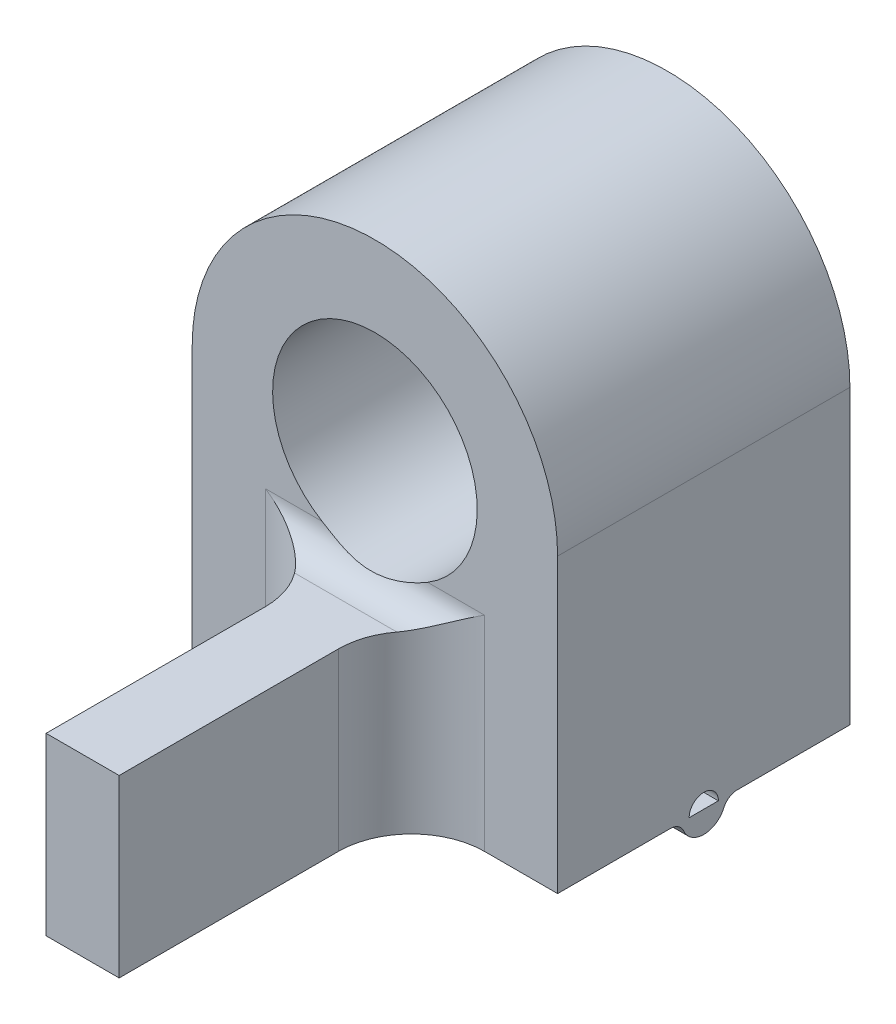
ISO-10303-21;
HEADER;
FILE_DESCRIPTION(('STEP AP214'),'2;1');
FILE_NAME('part.step','',(''),(''),'','','');
FILE_SCHEMA(('AUTOMOTIVE_DESIGN { 1 0 10303 214 1 1 1 1 }'));
ENDSEC;
DATA;
#1=APPLICATION_CONTEXT('core data for automotive mechanical design processes');
#2=APPLICATION_PROTOCOL_DEFINITION('international standard','automotive_design',2000,#1);
#3=PRODUCT_CONTEXT('',#1,'mechanical');
#4=PRODUCT('Part','Part','',(#3));
#5=PRODUCT_RELATED_PRODUCT_CATEGORY('part','',(#4));
#6=PRODUCT_DEFINITION_FORMATION('','',#4);
#7=PRODUCT_DEFINITION_CONTEXT('part definition',#1,'design');
#8=PRODUCT_DEFINITION('design','',#6,#7);
#9=PRODUCT_DEFINITION_SHAPE('','',#8);
#10=(LENGTH_UNIT() NAMED_UNIT(*) SI_UNIT(.MILLI.,.METRE.));
#11=(NAMED_UNIT(*) PLANE_ANGLE_UNIT() SI_UNIT($,.RADIAN.));
#12=(NAMED_UNIT(*) SI_UNIT($,.STERADIAN.) SOLID_ANGLE_UNIT());
#13=UNCERTAINTY_MEASURE_WITH_UNIT(LENGTH_MEASURE(1.E-05),#10,'distance_accuracy_value','');
#14=(GEOMETRIC_REPRESENTATION_CONTEXT(3) GLOBAL_UNCERTAINTY_ASSIGNED_CONTEXT((#13)) GLOBAL_UNIT_ASSIGNED_CONTEXT((#10,
#11,#12)) REPRESENTATION_CONTEXT('',''));
#15=CARTESIAN_POINT('',(0.,0.,0.));
#16=DIRECTION('',(0.,0.,1.));
#17=DIRECTION('',(1.,0.,0.));
#18=AXIS2_PLACEMENT_3D('',#15,#16,#17);
#19=CARTESIAN_POINT('',(12.5,0.,20.));
#20=DIRECTION('',(1.,0.,0.));
#21=DIRECTION('',(0.,1.,0.));
#22=AXIS2_PLACEMENT_3D('',#19,#20,#21);
#23=PLANE('',#22);
#24=CARTESIAN_POINT('',(12.5,-20.,10.));
#25=DIRECTION('',(1.,0.,0.));
#26=DIRECTION('',(0.,1.,0.));
#27=AXIS2_PLACEMENT_3D('',#24,#25,#26);
#28=CIRCLE('',#27,1.);
#29=CARTESIAN_POINT('',(12.5,-20.,9.));
#30=VERTEX_POINT('',#29);
#31=CARTESIAN_POINT('',(12.5,-20.,11.));
#32=VERTEX_POINT('',#31);
#33=EDGE_CURVE('E50',#30,#32,#28,.T.);
#34=ORIENTED_EDGE('',*,*,#33,.F.);
#35=DIRECTION('',(0.,0.,-1.));
#36=VECTOR('',#35,1.);
#37=CARTESIAN_POINT('',(12.5,-20.,9.));
#38=LINE('',#37,#36);
#39=EDGE_CURVE('E207',#32,#30,#38,.T.);
#40=ORIENTED_EDGE('',*,*,#39,.F.);
#41=EDGE_LOOP('',(#34,#40));
#42=FACE_BOUND('',#41,.T.);
#43=DIRECTION('',(0.,-1.,0.));
#44=VECTOR('',#43,1.);
#45=CARTESIAN_POINT('',(12.5,0.,0.));
#46=LINE('',#45,#44);
#47=CARTESIAN_POINT('',(12.5,0.,0.));
#48=VERTEX_POINT('',#47);
#49=CARTESIAN_POINT('',(12.5,-20.,0.));
#50=VERTEX_POINT('',#49);
#51=EDGE_CURVE('E333',#48,#50,#46,.T.);
#52=ORIENTED_EDGE('',*,*,#51,.F.);
#53=DIRECTION('',(0.,0.,-1.));
#54=VECTOR('',#53,1.);
#55=CARTESIAN_POINT('',(12.5,0.,20.));
#56=LINE('',#55,#54);
#57=CARTESIAN_POINT('',(12.5,0.,20.));
#58=VERTEX_POINT('',#57);
#59=EDGE_CURVE('E295',#58,#48,#56,.T.);
#60=ORIENTED_EDGE('',*,*,#59,.F.);
#61=DIRECTION('',(0.,-1.,0.));
#62=VECTOR('',#61,1.);
#63=CARTESIAN_POINT('',(12.5,0.,20.));
#64=LINE('',#63,#62);
#65=CARTESIAN_POINT('',(12.5,-20.,20.));
#66=VERTEX_POINT('',#65);
#67=EDGE_CURVE('E272',#58,#66,#64,.T.);
#68=ORIENTED_EDGE('',*,*,#67,.T.);
#69=DIRECTION('',(0.,0.,-1.));
#70=VECTOR('',#69,1.);
#71=CARTESIAN_POINT('',(12.5,-20.,20.));
#72=LINE('',#71,#70);
#73=CARTESIAN_POINT('',(12.5,-20.,12.2912878474779));
#74=VERTEX_POINT('',#73);
#75=EDGE_CURVE('E324',#66,#74,#72,.T.);
#76=ORIENTED_EDGE('',*,*,#75,.T.);
#77=CARTESIAN_POINT('',(12.5,-21.,12.2912878474779));
#78=DIRECTION('',(1.,0.,0.));
#79=DIRECTION('',(0.,1.,0.));
#80=AXIS2_PLACEMENT_3D('',#77,#78,#79);
#81=CIRCLE('',#80,1.);
#82=CARTESIAN_POINT('',(12.5,-20.6,11.3747727084868));
#83=VERTEX_POINT('',#82);
#84=EDGE_CURVE('E744',#74,#83,#81,.F.);
#85=ORIENTED_EDGE('',*,*,#84,.T.);
#86=CARTESIAN_POINT('',(12.5,-20.,10.));
#87=DIRECTION('',(1.,0.,0.));
#88=DIRECTION('',(0.,1.,0.));
#89=AXIS2_PLACEMENT_3D('',#86,#87,#88);
#90=CIRCLE('',#89,1.5);
#91=CARTESIAN_POINT('',(12.5,-20.6,8.62522729151325));
#92=VERTEX_POINT('',#91);
#93=EDGE_CURVE('E228',#83,#92,#90,.T.);
#94=ORIENTED_EDGE('',*,*,#93,.T.);
#95=CARTESIAN_POINT('',(12.5,-21.,7.70871215252208));
#96=DIRECTION('',(1.,0.,0.));
#97=DIRECTION('',(0.,1.,0.));
#98=AXIS2_PLACEMENT_3D('',#95,#96,#97);
#99=CIRCLE('',#98,1.);
#100=CARTESIAN_POINT('',(12.5,-20.,7.70871215252208));
#101=VERTEX_POINT('',#100);
#102=EDGE_CURVE('E740',#92,#101,#99,.F.);
#103=ORIENTED_EDGE('',*,*,#102,.T.);
#104=EDGE_CURVE('E294',#101,#50,#72,.T.);
#105=ORIENTED_EDGE('',*,*,#104,.T.);
#106=EDGE_LOOP('',(#52,#60,#68,#76,#85,#94,#103,#105));
#107=FACE_BOUND('',#106,.T.);
#108=ADVANCED_FACE('F35',(#42,#107),#23,.T.);
#109=CARTESIAN_POINT('',(0.,0.,20.));
#110=DIRECTION('',(0.,0.,-1.));
#111=DIRECTION('',(-1.,0.,0.));
#112=AXIS2_PLACEMENT_3D('',#109,#110,#111);
#113=CYLINDRICAL_SURFACE('',#112,12.5);
#114=CARTESIAN_POINT('',(0.,0.,0.));
#115=DIRECTION('',(0.,0.,1.));
#116=DIRECTION('',(1.,0.,0.));
#117=AXIS2_PLACEMENT_3D('',#114,#115,#116);
#118=CIRCLE('',#117,12.5);
#119=CARTESIAN_POINT('',(-12.5,0.,0.));
#120=VERTEX_POINT('',#119);
#121=EDGE_CURVE('E332',#48,#120,#118,.T.);
#122=ORIENTED_EDGE('',*,*,#121,.T.);
#123=DIRECTION('',(0.,0.,-1.));
#124=VECTOR('',#123,1.);
#125=CARTESIAN_POINT('',(-12.5,0.,20.));
#126=LINE('',#125,#124);
#127=CARTESIAN_POINT('',(-12.5,0.,20.));
#128=VERTEX_POINT('',#127);
#129=EDGE_CURVE('E311',#128,#120,#126,.T.);
#130=ORIENTED_EDGE('',*,*,#129,.F.);
#131=CARTESIAN_POINT('',(0.,0.,20.));
#132=DIRECTION('',(0.,0.,1.));
#133=DIRECTION('',(1.,0.,0.));
#134=AXIS2_PLACEMENT_3D('',#131,#132,#133);
#135=CIRCLE('',#134,12.5);
#136=EDGE_CURVE('E276',#58,#128,#135,.T.);
#137=ORIENTED_EDGE('',*,*,#136,.F.);
#138=ORIENTED_EDGE('',*,*,#59,.T.);
#139=EDGE_LOOP('',(#122,#130,#137,#138));
#140=FACE_BOUND('',#139,.T.);
#141=ADVANCED_FACE('F356',(#140),#113,.T.);
#142=CARTESIAN_POINT('',(-12.5,0.,20.));
#143=DIRECTION('',(-1.,0.,0.));
#144=DIRECTION('',(0.,-1.,0.));
#145=AXIS2_PLACEMENT_3D('',#142,#143,#144);
#146=PLANE('',#145);
#147=CARTESIAN_POINT('',(-12.5,-20.,10.));
#148=DIRECTION('',(-1.,0.,0.));
#149=DIRECTION('',(0.,-1.,0.));
#150=AXIS2_PLACEMENT_3D('',#147,#148,#149);
#151=CIRCLE('',#150,1.);
#152=CARTESIAN_POINT('',(-12.5,-20.,11.));
#153=VERTEX_POINT('',#152);
#154=CARTESIAN_POINT('',(-12.5,-20.,9.));
#155=VERTEX_POINT('',#154);
#156=EDGE_CURVE('E58',#153,#155,#151,.T.);
#157=ORIENTED_EDGE('',*,*,#156,.F.);
#158=DIRECTION('',(0.,0.,1.));
#159=VECTOR('',#158,1.);
#160=CARTESIAN_POINT('',(-12.5,-20.,11.));
#161=LINE('',#160,#159);
#162=EDGE_CURVE('E219',#155,#153,#161,.T.);
#163=ORIENTED_EDGE('',*,*,#162,.F.);
#164=EDGE_LOOP('',(#157,#163));
#165=FACE_BOUND('',#164,.T.);
#166=DIRECTION('',(0.,1.,0.));
#167=VECTOR('',#166,1.);
#168=CARTESIAN_POINT('',(-12.5,0.,0.));
#169=LINE('',#168,#167);
#170=CARTESIAN_POINT('',(-12.5,-20.,0.));
#171=VERTEX_POINT('',#170);
#172=EDGE_CURVE('E329',#171,#120,#169,.T.);
#173=ORIENTED_EDGE('',*,*,#172,.F.);
#174=DIRECTION('',(0.,0.,-1.));
#175=VECTOR('',#174,1.);
#176=CARTESIAN_POINT('',(-12.5,-20.,20.));
#177=LINE('',#176,#175);
#178=CARTESIAN_POINT('',(-12.5,-20.,7.70871215252208));
#179=VERTEX_POINT('',#178);
#180=EDGE_CURVE('E321',#179,#171,#177,.T.);
#181=ORIENTED_EDGE('',*,*,#180,.F.);
#182=CARTESIAN_POINT('',(-12.5,-21.,7.70871215252208));
#183=DIRECTION('',(-1.,0.,0.));
#184=DIRECTION('',(0.,-1.,0.));
#185=AXIS2_PLACEMENT_3D('',#182,#183,#184);
#186=CIRCLE('',#185,1.);
#187=CARTESIAN_POINT('',(-12.5,-20.6,8.62522729151325));
#188=VERTEX_POINT('',#187);
#189=EDGE_CURVE('E749',#179,#188,#186,.F.);
#190=ORIENTED_EDGE('',*,*,#189,.T.);
#191=CARTESIAN_POINT('',(-12.5,-20.,10.));
#192=DIRECTION('',(-1.,0.,0.));
#193=DIRECTION('',(0.,-1.,0.));
#194=AXIS2_PLACEMENT_3D('',#191,#192,#193);
#195=CIRCLE('',#194,1.5);
#196=CARTESIAN_POINT('',(-12.5,-20.6,11.3747727084868));
#197=VERTEX_POINT('',#196);
#198=EDGE_CURVE('E235',#188,#197,#195,.T.);
#199=ORIENTED_EDGE('',*,*,#198,.T.);
#200=CARTESIAN_POINT('',(-12.5,-21.,12.2912878474779));
#201=DIRECTION('',(-1.,0.,0.));
#202=DIRECTION('',(0.,-1.,0.));
#203=AXIS2_PLACEMENT_3D('',#200,#201,#202);
#204=CIRCLE('',#203,1.);
#205=CARTESIAN_POINT('',(-12.5,-20.,12.2912878474779));
#206=VERTEX_POINT('',#205);
#207=EDGE_CURVE('E43',#197,#206,#204,.F.);
#208=ORIENTED_EDGE('',*,*,#207,.T.);
#209=CARTESIAN_POINT('',(-12.5,-20.,20.));
#210=VERTEX_POINT('',#209);
#211=EDGE_CURVE('E316',#210,#206,#177,.T.);
#212=ORIENTED_EDGE('',*,*,#211,.F.);
#213=DIRECTION('',(0.,1.,0.));
#214=VECTOR('',#213,1.);
#215=CARTESIAN_POINT('',(-12.5,0.,20.));
#216=LINE('',#215,#214);
#217=EDGE_CURVE('E278',#210,#128,#216,.T.);
#218=ORIENTED_EDGE('',*,*,#217,.T.);
#219=ORIENTED_EDGE('',*,*,#129,.T.);
#220=EDGE_LOOP('',(#173,#181,#190,#199,#208,#212,#218,#219));
#221=FACE_BOUND('',#220,.T.);
#222=ADVANCED_FACE('F346',(#165,#221),#146,.T.);
#223=CARTESIAN_POINT('',(0.,0.,20.));
#224=DIRECTION('',(0.,0.,-1.));
#225=DIRECTION('',(-1.,0.,0.));
#226=AXIS2_PLACEMENT_3D('',#223,#224,#225);
#227=CYLINDRICAL_SURFACE('',#226,7.);
#228=CARTESIAN_POINT('',(0.,0.,20.));
#229=DIRECTION('',(0.,0.,1.));
#230=DIRECTION('',(1.,0.,0.));
#231=AXIS2_PLACEMENT_3D('',#228,#229,#230);
#232=CIRCLE('',#231,7.);
#233=CARTESIAN_POINT('',(3.605551275464,-5.99999999999999,20.));
#234=VERTEX_POINT('',#233);
#235=CARTESIAN_POINT('',(-3.605551275464,-6.,20.));
#236=VERTEX_POINT('',#235);
#237=EDGE_CURVE('E269',#234,#236,#232,.T.);
#238=ORIENTED_EDGE('',*,*,#237,.T.);
#239=CARTESIAN_POINT('',(-3.605551275464,-6.,20.));
#240=CARTESIAN_POINT('',(-3.53432048102537,-6.04280554000611,20.0000052437066));
#241=CARTESIAN_POINT('',(-3.46234496067296,-6.0843296416087,20.001373536534));
#242=CARTESIAN_POINT('',(-3.31704405036379,-6.16474724767076,20.006388907801));
#243=CARTESIAN_POINT('',(-3.24371909032203,-6.20364157210089,20.0100352722672));
#244=CARTESIAN_POINT('',(-3.02207877989753,-6.31620710904345,20.023709022089));
#245=CARTESIAN_POINT('',(-2.87188820423656,-6.38588685328801,20.0364737096436));
#246=CARTESIAN_POINT('',(-2.56664415610242,-6.5145924592435,20.0662019412915));
#247=CARTESIAN_POINT('',(-2.41157146533049,-6.57356775101399,20.0831845616968));
#248=CARTESIAN_POINT('',(-2.09769830799348,-6.68035567246579,20.1184373568101));
#249=CARTESIAN_POINT('',(-1.93889619580063,-6.72816326847294,20.1367081073123));
#250=CARTESIAN_POINT('',(-1.60210650299827,-6.81663551307329,20.1736281303883));
#251=CARTESIAN_POINT('',(-1.42378787306705,-6.85610848679676,20.1921326840965));
#252=CARTESIAN_POINT('',(-1.0641956350596,-6.9210442693862,20.22433162066));
#253=CARTESIAN_POINT('',(-0.882922508812633,-6.94650933962889,20.2380267797944));
#254=CARTESIAN_POINT('',(-0.519112622070642,-6.98311010663703,20.2581797413056));
#255=CARTESIAN_POINT('',(-0.336581955160373,-6.99429252202132,20.2646611309568));
#256=CARTESIAN_POINT('',(0.0288960052409431,-7.00232597520179,20.2692871417638));
#257=CARTESIAN_POINT('',(0.211843271171269,-6.99917793501154,20.2674322992682));
#258=CARTESIAN_POINT('',(0.573979388770206,-6.9787507270447,20.2558165661555));
#259=CARTESIAN_POINT('',(0.753184002460541,-6.96167955838554,20.2461720665111));
#260=CARTESIAN_POINT('',(1.10933871445076,-6.91387481374104,20.2207986658078));
#261=CARTESIAN_POINT('',(1.28628833525172,-6.88313839198442,20.2050684975048));
#262=CARTESIAN_POINT('',(1.63729887212892,-6.80819602102539,20.1701021429337));
#263=CARTESIAN_POINT('',(1.81135343994652,-6.76396376493143,20.1508591389276));
#264=CARTESIAN_POINT('',(2.15548963057008,-6.66228500602849,20.1120545034982));
#265=CARTESIAN_POINT('',(2.32557232102557,-6.60484210037705,20.0924929601555));
#266=CARTESIAN_POINT('',(2.58962084508023,-6.50418992327622,20.0642202852868));
#267=CARTESIAN_POINT('',(2.68515218154569,-6.46533878259431,20.0544363514869));
#268=CARTESIAN_POINT('',(2.87451968474888,-6.38339846045006,20.0366449882506));
#269=CARTESIAN_POINT('',(2.96835640799681,-6.34031070139059,20.0286369654892));
#270=CARTESIAN_POINT('',(3.15394471609858,-6.25005978730666,20.0151700814082));
#271=CARTESIAN_POINT('',(3.24570106506417,-6.2029074579696,20.009704682345));
#272=CARTESIAN_POINT('',(3.42720784823329,-6.10450033811442,20.0021252573919));
#273=CARTESIAN_POINT('',(3.51695680902649,-6.05324265303371,20.0000136183807));
#274=CARTESIAN_POINT('',(3.605551275464,-5.99999999999999,20.));
#275=B_SPLINE_CURVE_WITH_KNOTS('',3,(#239,#240,#241,#242,#243,#244,#245,#246,#247,#248,#249,
#250,#251,#252,#253,#254,#255,#256,#257,#258,#259,#260,#261,#262,#263,#264,#265,#266,#267,#268,
#269,#270,#271,#272,#273,#274),.UNSPECIFIED.,.F.,.F.,(4,2,2,2,2,2,2,2,2,2,2,2,2,2,2,2,2,4),(0.,
0.249249911849309,0.498421745142239,0.996033721950991,1.49593857552004,1.99606832091889,
2.54619020525349,3.0962232541541,3.64445249614229,4.19264646586298,4.73279773670783,
5.27306154608233,5.81438527197772,6.35556177376916,6.66624152717653,6.97681732679131,
7.28659008082171,7.59658320220154),.UNSPECIFIED.);
#276=EDGE_CURVE('E660',#236,#234,#275,.T.);
#277=ORIENTED_EDGE('',*,*,#276,.T.);
#278=EDGE_LOOP('',(#238,#277));
#279=FACE_BOUND('',#278,.T.);
#280=CARTESIAN_POINT('',(0.,0.,0.));
#281=DIRECTION('',(0.,0.,1.));
#282=DIRECTION('',(1.,0.,0.));
#283=AXIS2_PLACEMENT_3D('',#280,#281,#282);
#284=CIRCLE('',#283,7.);
#285=CARTESIAN_POINT('',(7.,0.,0.));
#286=VERTEX_POINT('',#285);
#287=EDGE_CURVE('E265',#286,#286,#284,.T.);
#288=ORIENTED_EDGE('',*,*,#287,.F.);
#289=EDGE_LOOP('',(#288));
#290=FACE_BOUND('',#289,.T.);
#291=ADVANCED_FACE('F343',(#279,#290),#227,.F.);
#292=CARTESIAN_POINT('',(0.,-20.,20.));
#293=DIRECTION('',(0.,-1.,0.));
#294=DIRECTION('',(1.,0.,0.));
#295=AXIS2_PLACEMENT_3D('',#292,#293,#294);
#296=PLANE('',#295);
#297=ORIENTED_EDGE('',*,*,#104,.F.);
#298=DIRECTION('',(-1.,0.,0.));
#299=VECTOR('',#298,1.);
#300=CARTESIAN_POINT('',(2.5,-20.,7.70871215252208));
#301=LINE('',#300,#299);
#302=CARTESIAN_POINT('',(2.5,-20.,7.70871215252208));
#303=VERTEX_POINT('',#302);
#304=EDGE_CURVE('E733',#101,#303,#301,.T.);
#305=ORIENTED_EDGE('',*,*,#304,.T.);
#306=DIRECTION('',(0.,0.,1.));
#307=VECTOR('',#306,1.);
#308=CARTESIAN_POINT('',(2.5,-20.,11.5));
#309=LINE('',#308,#307);
#310=CARTESIAN_POINT('',(2.5,-20.,12.2912878474779));
#311=VERTEX_POINT('',#310);
#312=EDGE_CURVE('E233',#303,#311,#309,.T.);
#313=ORIENTED_EDGE('',*,*,#312,.T.);
#314=DIRECTION('',(-1.,0.,0.));
#315=VECTOR('',#314,1.);
#316=CARTESIAN_POINT('',(12.5,-20.,12.2912878474779));
#317=LINE('',#316,#315);
#318=EDGE_CURVE('E728',#311,#74,#317,.F.);
#319=ORIENTED_EDGE('',*,*,#318,.T.);
#320=ORIENTED_EDGE('',*,*,#75,.F.);
#321=DIRECTION('',(-1.,0.,0.));
#322=VECTOR('',#321,1.);
#323=CARTESIAN_POINT('',(0.,-20.,20.));
#324=LINE('',#323,#322);
#325=CARTESIAN_POINT('',(7.5,-20.,20.));
#326=VERTEX_POINT('',#325);
#327=EDGE_CURVE('E290',#66,#326,#324,.T.);
#328=ORIENTED_EDGE('',*,*,#327,.T.);
#329=CARTESIAN_POINT('',(7.5,-20.,25.));
#330=DIRECTION('',(0.,-1.,0.));
#331=DIRECTION('',(1.,0.,0.));
#332=AXIS2_PLACEMENT_3D('',#329,#330,#331);
#333=CIRCLE('',#332,5.);
#334=CARTESIAN_POINT('',(2.5,-20.,25.));
#335=VERTEX_POINT('',#334);
#336=EDGE_CURVE('E687',#326,#335,#333,.F.);
#337=ORIENTED_EDGE('',*,*,#336,.T.);
#338=DIRECTION('',(0.,0.,-1.));
#339=VECTOR('',#338,1.);
#340=CARTESIAN_POINT('',(2.5,-20.,40.));
#341=LINE('',#340,#339);
#342=CARTESIAN_POINT('',(2.5,-20.,40.));
#343=VERTEX_POINT('',#342);
#344=EDGE_CURVE('E261',#343,#335,#341,.T.);
#345=ORIENTED_EDGE('',*,*,#344,.F.);
#346=DIRECTION('',(1.,0.,0.));
#347=VECTOR('',#346,1.);
#348=CARTESIAN_POINT('',(2.5,-20.,40.));
#349=LINE('',#348,#347);
#350=CARTESIAN_POINT('',(-2.5,-20.,40.));
#351=VERTEX_POINT('',#350);
#352=EDGE_CURVE('E243',#351,#343,#349,.T.);
#353=ORIENTED_EDGE('',*,*,#352,.F.);
#354=DIRECTION('',(0.,0.,-1.));
#355=VECTOR('',#354,1.);
#356=CARTESIAN_POINT('',(-2.5,-20.,40.));
#357=LINE('',#356,#355);
#358=CARTESIAN_POINT('',(-2.5,-20.,25.));
#359=VERTEX_POINT('',#358);
#360=EDGE_CURVE('E254',#351,#359,#357,.T.);
#361=ORIENTED_EDGE('',*,*,#360,.T.);
#362=CARTESIAN_POINT('',(-7.5,-20.,25.));
#363=DIRECTION('',(0.,-1.,0.));
#364=DIRECTION('',(1.,0.,0.));
#365=AXIS2_PLACEMENT_3D('',#362,#363,#364);
#366=CIRCLE('',#365,5.);
#367=CARTESIAN_POINT('',(-7.5,-20.,20.));
#368=VERTEX_POINT('',#367);
#369=EDGE_CURVE('E685',#359,#368,#366,.F.);
#370=ORIENTED_EDGE('',*,*,#369,.T.);
#371=EDGE_CURVE('E281',#368,#210,#324,.T.);
#372=ORIENTED_EDGE('',*,*,#371,.T.);
#373=ORIENTED_EDGE('',*,*,#211,.T.);
#374=DIRECTION('',(1.,0.,0.));
#375=VECTOR('',#374,1.);
#376=CARTESIAN_POINT('',(-2.5,-20.,12.2912878474779));
#377=LINE('',#376,#375);
#378=CARTESIAN_POINT('',(-2.5,-20.,12.2912878474779));
#379=VERTEX_POINT('',#378);
#380=EDGE_CURVE('E720',#206,#379,#377,.T.);
#381=ORIENTED_EDGE('',*,*,#380,.T.);
#382=DIRECTION('',(0.,0.,-1.));
#383=VECTOR('',#382,1.);
#384=CARTESIAN_POINT('',(-2.5,-20.,8.5));
#385=LINE('',#384,#383);
#386=CARTESIAN_POINT('',(-2.5,-20.,7.70871215252208));
#387=VERTEX_POINT('',#386);
#388=EDGE_CURVE('E241',#379,#387,#385,.T.);
#389=ORIENTED_EDGE('',*,*,#388,.T.);
#390=DIRECTION('',(1.,0.,0.));
#391=VECTOR('',#390,1.);
#392=CARTESIAN_POINT('',(-12.5,-20.,7.70871215252208));
#393=LINE('',#392,#391);
#394=EDGE_CURVE('E724',#387,#179,#393,.F.);
#395=ORIENTED_EDGE('',*,*,#394,.T.);
#396=ORIENTED_EDGE('',*,*,#180,.T.);
#397=DIRECTION('',(-1.,0.,0.));
#398=VECTOR('',#397,1.);
#399=CARTESIAN_POINT('',(0.,-20.,0.));
#400=LINE('',#399,#398);
#401=EDGE_CURVE('E273',#50,#171,#400,.T.);
#402=ORIENTED_EDGE('',*,*,#401,.F.);
#403=EDGE_LOOP('',(#297,#305,#313,#319,#320,#328,#337,#345,#353,#361,#370,#372,#373,#381,#389,
#395,#396,#402));
#404=FACE_BOUND('',#403,.T.);
#405=CARTESIAN_POINT('',(0.,-20.,10.));
#406=DIRECTION('',(0.,-1.,0.));
#407=DIRECTION('',(1.,0.,0.));
#408=AXIS2_PLACEMENT_3D('',#405,#406,#407);
#409=CIRCLE('',#408,1.5);
#410=CARTESIAN_POINT('',(1.5,-20.,10.));
#411=VERTEX_POINT('',#410);
#412=EDGE_CURVE('E266',#411,#411,#409,.T.);
#413=ORIENTED_EDGE('',*,*,#412,.F.);
#414=EDGE_LOOP('',(#413));
#415=FACE_BOUND('',#414,.T.);
#416=ADVANCED_FACE('F345',(#404,#415),#296,.T.);
#417=CARTESIAN_POINT('',(0.,0.,20.));
#418=DIRECTION('',(0.,0.,1.));
#419=DIRECTION('',(1.,0.,0.));
#420=AXIS2_PLACEMENT_3D('',#417,#418,#419);
#421=PLANE('',#420);
#422=DIRECTION('',(0.,-1.,0.));
#423=VECTOR('',#422,1.);
#424=CARTESIAN_POINT('',(-7.5,0.,20.));
#425=LINE('',#424,#423);
#426=CARTESIAN_POINT('',(-7.5,-6.,20.));
#427=VERTEX_POINT('',#426);
#428=EDGE_CURVE('E306',#368,#427,#425,.F.);
#429=ORIENTED_EDGE('',*,*,#428,.T.);
#430=DIRECTION('',(-1.,0.,0.));
#431=VECTOR('',#430,1.);
#432=CARTESIAN_POINT('',(0.,-6.,20.));
#433=LINE('',#432,#431);
#434=EDGE_CURVE('E675',#427,#236,#433,.F.);
#435=ORIENTED_EDGE('',*,*,#434,.T.);
#436=ORIENTED_EDGE('',*,*,#237,.F.);
#437=DIRECTION('',(-1.,0.,0.));
#438=VECTOR('',#437,1.);
#439=CARTESIAN_POINT('',(0.,-6.,20.));
#440=LINE('',#439,#438);
#441=CARTESIAN_POINT('',(7.5,-5.99999999999999,20.));
#442=VERTEX_POINT('',#441);
#443=EDGE_CURVE('E677',#234,#442,#440,.F.);
#444=ORIENTED_EDGE('',*,*,#443,.T.);
#445=DIRECTION('',(0.,1.,0.));
#446=VECTOR('',#445,1.);
#447=CARTESIAN_POINT('',(7.5,0.,20.));
#448=LINE('',#447,#446);
#449=EDGE_CURVE('E310',#442,#326,#448,.F.);
#450=ORIENTED_EDGE('',*,*,#449,.T.);
#451=ORIENTED_EDGE('',*,*,#327,.F.);
#452=ORIENTED_EDGE('',*,*,#67,.F.);
#453=ORIENTED_EDGE('',*,*,#136,.T.);
#454=ORIENTED_EDGE('',*,*,#217,.F.);
#455=ORIENTED_EDGE('',*,*,#371,.F.);
#456=EDGE_LOOP('',(#429,#435,#436,#444,#450,#451,#452,#453,#454,#455));
#457=FACE_BOUND('',#456,.T.);
#458=ADVANCED_FACE('F353',(#457),#421,.T.);
#459=CARTESIAN_POINT('',(0.,0.,0.));
#460=DIRECTION('',(0.,0.,1.));
#461=DIRECTION('',(1.,0.,0.));
#462=AXIS2_PLACEMENT_3D('',#459,#460,#461);
#463=PLANE('',#462);
#464=ORIENTED_EDGE('',*,*,#287,.T.);
#465=EDGE_LOOP('',(#464));
#466=FACE_BOUND('',#465,.T.);
#467=ORIENTED_EDGE('',*,*,#51,.T.);
#468=ORIENTED_EDGE('',*,*,#401,.T.);
#469=ORIENTED_EDGE('',*,*,#172,.T.);
#470=ORIENTED_EDGE('',*,*,#121,.F.);
#471=EDGE_LOOP('',(#467,#468,#469,#470));
#472=FACE_BOUND('',#471,.T.);
#473=ADVANCED_FACE('F341',(#466,#472),#463,.F.);
#474=CARTESIAN_POINT('',(0.,-10.,10.));
#475=DIRECTION('',(0.,-1.,0.));
#476=DIRECTION('',(1.,0.,0.));
#477=AXIS2_PLACEMENT_3D('',#474,#475,#476);
#478=CYLINDRICAL_SURFACE('',#477,1.5);
#479=CARTESIAN_POINT('',(0.,-10.,10.));
#480=DIRECTION('',(0.,-1.,0.));
#481=DIRECTION('',(1.,0.,0.));
#482=AXIS2_PLACEMENT_3D('',#479,#480,#481);
#483=CIRCLE('',#482,1.5);
#484=CARTESIAN_POINT('',(1.5,-10.,10.));
#485=VERTEX_POINT('',#484);
#486=EDGE_CURVE('E262',#485,#485,#483,.T.);
#487=ORIENTED_EDGE('',*,*,#486,.F.);
#488=EDGE_LOOP('',(#487));
#489=FACE_BOUND('',#488,.T.);
#490=ORIENTED_EDGE('',*,*,#412,.T.);
#491=EDGE_LOOP('',(#490));
#492=FACE_BOUND('',#491,.T.);
#493=ADVANCED_FACE('F372',(#489,#492),#478,.F.);
#494=CARTESIAN_POINT('',(0.,-10.,10.));
#495=DIRECTION('',(0.,-1.,0.));
#496=DIRECTION('',(1.,0.,0.));
#497=AXIS2_PLACEMENT_3D('',#494,#495,#496);
#498=PLANE('',#497);
#499=ORIENTED_EDGE('',*,*,#486,.T.);
#500=EDGE_LOOP('',(#499));
#501=FACE_BOUND('',#500,.T.);
#502=ADVANCED_FACE('F378',(#501),#498,.T.);
#503=CARTESIAN_POINT('',(2.5,-7.99999999999999,40.));
#504=DIRECTION('',(-1.,0.,0.));
#505=DIRECTION('',(0.,-1.,0.));
#506=AXIS2_PLACEMENT_3D('',#503,#504,#505);
#507=PLANE('',#506);
#508=ORIENTED_EDGE('',*,*,#344,.T.);
#509=DIRECTION('',(0.,1.,0.));
#510=VECTOR('',#509,1.);
#511=CARTESIAN_POINT('',(2.5,-7.99999999999999,25.));
#512=LINE('',#511,#510);
#513=CARTESIAN_POINT('',(2.5,-7.99999999999999,25.));
#514=VERTEX_POINT('',#513);
#515=EDGE_CURVE('E304',#335,#514,#512,.T.);
#516=ORIENTED_EDGE('',*,*,#515,.T.);
#517=DIRECTION('',(0.,0.,-1.));
#518=VECTOR('',#517,1.);
#519=CARTESIAN_POINT('',(2.5,-7.99999999999999,40.));
#520=LINE('',#519,#518);
#521=CARTESIAN_POINT('',(2.5,-7.99999999999999,40.));
#522=VERTEX_POINT('',#521);
#523=EDGE_CURVE('E258',#522,#514,#520,.T.);
#524=ORIENTED_EDGE('',*,*,#523,.F.);
#525=DIRECTION('',(0.,1.,0.));
#526=VECTOR('',#525,1.);
#527=CARTESIAN_POINT('',(2.5,-7.99999999999999,40.));
#528=LINE('',#527,#526);
#529=EDGE_CURVE('E248',#343,#522,#528,.T.);
#530=ORIENTED_EDGE('',*,*,#529,.F.);
#531=EDGE_LOOP('',(#508,#516,#524,#530));
#532=FACE_BOUND('',#531,.T.);
#533=ADVANCED_FACE('F382',(#532),#507,.F.);
#534=CARTESIAN_POINT('',(-2.5,-8.,40.));
#535=DIRECTION('',(0.,-1.,0.));
#536=DIRECTION('',(1.,0.,0.));
#537=AXIS2_PLACEMENT_3D('',#534,#535,#536);
#538=PLANE('',#537);
#539=CARTESIAN_POINT('',(7.5,-7.99999999999999,25.));
#540=DIRECTION('',(0.,-1.,0.));
#541=DIRECTION('',(1.,0.,0.));
#542=AXIS2_PLACEMENT_3D('',#539,#540,#541);
#543=CIRCLE('',#542,5.);
#544=CARTESIAN_POINT('',(3.5,-7.99999999999999,22.));
#545=VERTEX_POINT('',#544);
#546=EDGE_CURVE('E689',#514,#545,#543,.T.);
#547=ORIENTED_EDGE('',*,*,#546,.T.);
#548=DIRECTION('',(-1.,0.,0.));
#549=VECTOR('',#548,1.);
#550=CARTESIAN_POINT('',(-2.5,-8.,22.));
#551=LINE('',#550,#549);
#552=CARTESIAN_POINT('',(-3.5,-8.,22.));
#553=VERTEX_POINT('',#552);
#554=EDGE_CURVE('E680',#545,#553,#551,.T.);
#555=ORIENTED_EDGE('',*,*,#554,.T.);
#556=CARTESIAN_POINT('',(-7.5,-8.,25.));
#557=DIRECTION('',(0.,-1.,0.));
#558=DIRECTION('',(1.,0.,0.));
#559=AXIS2_PLACEMENT_3D('',#556,#557,#558);
#560=CIRCLE('',#559,5.);
#561=CARTESIAN_POINT('',(-2.5,-8.,25.));
#562=VERTEX_POINT('',#561);
#563=EDGE_CURVE('E683',#553,#562,#560,.T.);
#564=ORIENTED_EDGE('',*,*,#563,.T.);
#565=DIRECTION('',(0.,0.,-1.));
#566=VECTOR('',#565,1.);
#567=CARTESIAN_POINT('',(-2.5,-8.,40.));
#568=LINE('',#567,#566);
#569=CARTESIAN_POINT('',(-2.5,-8.,40.));
#570=VERTEX_POINT('',#569);
#571=EDGE_CURVE('E255',#570,#562,#568,.T.);
#572=ORIENTED_EDGE('',*,*,#571,.F.);
#573=DIRECTION('',(-1.,0.,0.));
#574=VECTOR('',#573,1.);
#575=CARTESIAN_POINT('',(-2.5,-8.,40.));
#576=LINE('',#575,#574);
#577=EDGE_CURVE('E250',#522,#570,#576,.T.);
#578=ORIENTED_EDGE('',*,*,#577,.F.);
#579=ORIENTED_EDGE('',*,*,#523,.T.);
#580=EDGE_LOOP('',(#547,#555,#564,#572,#578,#579));
#581=FACE_BOUND('',#580,.T.);
#582=ADVANCED_FACE('F386',(#581),#538,.F.);
#583=CARTESIAN_POINT('',(-2.5,-20.,40.));
#584=DIRECTION('',(1.,0.,0.));
#585=DIRECTION('',(0.,1.,0.));
#586=AXIS2_PLACEMENT_3D('',#583,#584,#585);
#587=PLANE('',#586);
#588=ORIENTED_EDGE('',*,*,#571,.T.);
#589=DIRECTION('',(0.,-1.,0.));
#590=VECTOR('',#589,1.);
#591=CARTESIAN_POINT('',(-2.5,-20.,25.));
#592=LINE('',#591,#590);
#593=EDGE_CURVE('E692',#562,#359,#592,.T.);
#594=ORIENTED_EDGE('',*,*,#593,.T.);
#595=ORIENTED_EDGE('',*,*,#360,.F.);
#596=DIRECTION('',(0.,-1.,0.));
#597=VECTOR('',#596,1.);
#598=CARTESIAN_POINT('',(-2.5,-20.,40.));
#599=LINE('',#598,#597);
#600=EDGE_CURVE('E252',#570,#351,#599,.T.);
#601=ORIENTED_EDGE('',*,*,#600,.F.);
#602=EDGE_LOOP('',(#588,#594,#595,#601));
#603=FACE_BOUND('',#602,.T.);
#604=ADVANCED_FACE('F389',(#603),#587,.F.);
#605=CARTESIAN_POINT('',(0.,0.,40.));
#606=DIRECTION('',(0.,0.,-1.));
#607=DIRECTION('',(-1.,0.,0.));
#608=AXIS2_PLACEMENT_3D('',#605,#606,#607);
#609=PLANE('',#608);
#610=ORIENTED_EDGE('',*,*,#352,.T.);
#611=ORIENTED_EDGE('',*,*,#529,.T.);
#612=ORIENTED_EDGE('',*,*,#577,.T.);
#613=ORIENTED_EDGE('',*,*,#600,.T.);
#614=EDGE_LOOP('',(#610,#611,#612,#613));
#615=FACE_BOUND('',#614,.T.);
#616=ADVANCED_FACE('F393',(#615),#609,.F.);
#617=CARTESIAN_POINT('',(7.5,-7.99999999999999,25.));
#618=DIRECTION('',(0.,1.,0.));
#619=DIRECTION('',(-1.,0.,0.));
#620=AXIS2_PLACEMENT_3D('',#617,#618,#619);
#621=CYLINDRICAL_SURFACE('',#620,5.);
#622=ORIENTED_EDGE('',*,*,#336,.F.);
#623=ORIENTED_EDGE('',*,*,#449,.F.);
#624=CARTESIAN_POINT('',(3.5,-7.99999999999999,22.));
#625=CARTESIAN_POINT('',(3.55129193893793,-7.99999324027343,21.9315858443193));
#626=CARTESIAN_POINT('',(3.6043221905044,-7.99649157203366,21.8645582185277));
#627=CARTESIAN_POINT('',(3.71332731033451,-7.98328909709585,21.7337630195359));
#628=CARTESIAN_POINT('',(3.76929693062615,-7.97359901559983,21.6699900118236));
#629=CARTESIAN_POINT('',(3.88328476437085,-7.94892281271752,21.5465415072406));
#630=CARTESIAN_POINT('',(3.94127844715956,-7.93398790953144,21.4868328230552));
#631=CARTESIAN_POINT('',(4.05947323824069,-7.89947772515857,21.3710020267293));
#632=CARTESIAN_POINT('',(4.11967562411215,-7.87989972131968,21.3148820435623));
#633=CARTESIAN_POINT('',(4.26789143803195,-7.82755585094214,21.1833228460575));
#634=CARTESIAN_POINT('',(4.35686979366097,-7.7927185752936,21.1097861813867));
#635=CARTESIAN_POINT('',(4.53781490340136,-7.71639941519361,20.9702943076288));
#636=CARTESIAN_POINT('',(4.62978239550727,-7.674915879745,20.9043409893311));
#637=CARTESIAN_POINT('',(4.91032568053493,-7.54188878041779,20.7169733012532));
#638=CARTESIAN_POINT('',(5.10264881082766,-7.44210610731426,20.6068318494825));
#639=CARTESIAN_POINT('',(5.43600680868792,-7.25973640075639,20.4432848498546));
#640=CARTESIAN_POINT('',(5.57560415503041,-7.18064651072463,20.3827054455412));
#641=CARTESIAN_POINT('',(5.85708645804536,-7.01720624205802,20.2752228503533));
#642=CARTESIAN_POINT('',(5.99897239325798,-6.93285356647544,20.2283256825108));
#643=CARTESIAN_POINT('',(6.28395127368356,-6.76068856633995,20.1478758852136));
#644=CARTESIAN_POINT('',(6.42704109346035,-6.67288380492052,20.1142956946986));
#645=CARTESIAN_POINT('',(6.71412741845206,-6.49496780866633,20.0599857310582));
#646=CARTESIAN_POINT('',(6.85812361863148,-6.40485732147118,20.0392518461052));
#647=CARTESIAN_POINT('',(7.16407411802257,-6.21244521431831,20.0086525171965));
#648=CARTESIAN_POINT('',(7.32609778000312,-6.10998511039017,20.0004013073906));
#649=CARTESIAN_POINT('',(7.49203185351332,-6.00503949768124,20.0000047645927));
#650=CARTESIAN_POINT('',(7.49601595215054,-6.00251973242474,20.0000000029522));
#651=CARTESIAN_POINT('',(7.5,-5.99999999999999,20.));
#652=B_SPLINE_CURVE_WITH_KNOTS('',3,(#624,#625,#626,#627,#628,#629,#630,#631,#632,#633,#634,
#635,#636,#637,#638,#639,#640,#641,#642,#643,#644,#645,#646,#647,#648,#649,#650,#651),
.UNSPECIFIED.,.F.,.F.,(4,2,2,2,2,2,2,2,2,2,2,2,2,4),(0.,0.256323586120828,0.51220413635085,
0.765652360303642,1.01924957198092,1.38041574025914,1.74167176531575,2.46784096790537,
2.98178501814787,3.49595497056337,4.00905516339224,4.5219910388693,5.09684964624113,
5.11099178908029),.UNSPECIFIED.);
#653=EDGE_CURVE('E653',#442,#545,#652,.F.);
#654=ORIENTED_EDGE('',*,*,#653,.T.);
#655=ORIENTED_EDGE('',*,*,#546,.F.);
#656=ORIENTED_EDGE('',*,*,#515,.F.);
#657=EDGE_LOOP('',(#622,#623,#654,#655,#656));
#658=FACE_BOUND('',#657,.T.);
#659=ADVANCED_FACE('F397',(#658),#621,.F.);
#660=CARTESIAN_POINT('',(-7.5,-20.,25.));
#661=DIRECTION('',(0.,-1.,0.));
#662=DIRECTION('',(1.,0.,0.));
#663=AXIS2_PLACEMENT_3D('',#660,#661,#662);
#664=CYLINDRICAL_SURFACE('',#663,5.);
#665=ORIENTED_EDGE('',*,*,#563,.F.);
#666=CARTESIAN_POINT('',(-3.5,-8.,22.));
#667=CARTESIAN_POINT('',(-3.55129193893793,-7.99999324027343,21.9315858443193));
#668=CARTESIAN_POINT('',(-3.6043221905044,-7.99649157203366,21.8645582185277));
#669=CARTESIAN_POINT('',(-3.71332731033451,-7.98328909709585,21.7337630195359));
#670=CARTESIAN_POINT('',(-3.76929693062614,-7.97359901559983,21.6699900118236));
#671=CARTESIAN_POINT('',(-3.88328476437085,-7.94892281271753,21.5465415072406));
#672=CARTESIAN_POINT('',(-3.94127844715955,-7.93398790953144,21.4868328230552));
#673=CARTESIAN_POINT('',(-4.05947323824069,-7.89947772515857,21.3710020267293));
#674=CARTESIAN_POINT('',(-4.11967562411215,-7.87989972131968,21.3148820435623));
#675=CARTESIAN_POINT('',(-4.26789143803194,-7.82755585094214,21.1833228460575));
#676=CARTESIAN_POINT('',(-4.35686979366096,-7.79271857529361,21.1097861813867));
#677=CARTESIAN_POINT('',(-4.53781490340136,-7.71639941519362,20.9702943076288));
#678=CARTESIAN_POINT('',(-4.62978239550726,-7.674915879745,20.9043409893311));
#679=CARTESIAN_POINT('',(-4.91032568053493,-7.5418887804178,20.7169733012532));
#680=CARTESIAN_POINT('',(-5.10264881082766,-7.44210610731427,20.6068318494825));
#681=CARTESIAN_POINT('',(-5.43600680868792,-7.2597364007564,20.4432848498546));
#682=CARTESIAN_POINT('',(-5.57560415503041,-7.18064651072463,20.3827054455412));
#683=CARTESIAN_POINT('',(-5.85708645804535,-7.01720624205802,20.2752228503533));
#684=CARTESIAN_POINT('',(-5.99897239325798,-6.93285356647545,20.2283256825108));
#685=CARTESIAN_POINT('',(-6.28395127368356,-6.76068856633995,20.1478758852136));
#686=CARTESIAN_POINT('',(-6.42704109346035,-6.67288380492053,20.1142956946986));
#687=CARTESIAN_POINT('',(-6.71412741845206,-6.49496780866633,20.0599857310582));
#688=CARTESIAN_POINT('',(-6.85812361863148,-6.40485732147119,20.0392518461052));
#689=CARTESIAN_POINT('',(-7.16407411802256,-6.21244521431831,20.0086525171965));
#690=CARTESIAN_POINT('',(-7.32609778000311,-6.10998511039016,20.0004013073906));
#691=CARTESIAN_POINT('',(-7.49203185351331,-6.00503949768125,20.0000047645927));
#692=CARTESIAN_POINT('',(-7.49601595215054,-6.00251973242474,20.0000000029522));
#693=CARTESIAN_POINT('',(-7.5,-6.,20.));
#694=B_SPLINE_CURVE_WITH_KNOTS('',3,(#666,#667,#668,#669,#670,#671,#672,#673,#674,#675,#676,
#677,#678,#679,#680,#681,#682,#683,#684,#685,#686,#687,#688,#689,#690,#691,#692,#693),
.UNSPECIFIED.,.F.,.F.,(4,2,2,2,2,2,2,2,2,2,2,2,2,4),(0.,0.256323586120828,0.51220413635085,
0.765652360303642,1.01924957198092,1.38041574025913,1.74167176531575,2.46784096790537,
2.98178501814787,3.49595497056337,4.00905516339223,4.5219910388693,5.09684964624113,
5.11099178908029),.UNSPECIFIED.);
#695=EDGE_CURVE('E669',#553,#427,#694,.T.);
#696=ORIENTED_EDGE('',*,*,#695,.T.);
#697=ORIENTED_EDGE('',*,*,#428,.F.);
#698=ORIENTED_EDGE('',*,*,#369,.F.);
#699=ORIENTED_EDGE('',*,*,#593,.F.);
#700=EDGE_LOOP('',(#665,#696,#697,#698,#699));
#701=FACE_BOUND('',#700,.T.);
#702=ADVANCED_FACE('F507',(#701),#664,.F.);
#703=CARTESIAN_POINT('',(-2.5,-6.,22.));
#704=DIRECTION('',(-1.,0.,0.));
#705=DIRECTION('',(0.,-1.,0.));
#706=AXIS2_PLACEMENT_3D('',#703,#704,#705);
#707=CYLINDRICAL_SURFACE('',#706,2.);
#708=ORIENTED_EDGE('',*,*,#276,.F.);
#709=ORIENTED_EDGE('',*,*,#434,.F.);
#710=ORIENTED_EDGE('',*,*,#695,.F.);
#711=ORIENTED_EDGE('',*,*,#554,.F.);
#712=ORIENTED_EDGE('',*,*,#653,.F.);
#713=ORIENTED_EDGE('',*,*,#443,.F.);
#714=EDGE_LOOP('',(#708,#709,#710,#711,#712,#713));
#715=FACE_BOUND('',#714,.T.);
#716=ADVANCED_FACE('F403',(#715),#707,.F.);
#717=CARTESIAN_POINT('',(-2.5,-20.,10.));
#718=DIRECTION('',(-1.,0.,0.));
#719=DIRECTION('',(0.,-1.,0.));
#720=AXIS2_PLACEMENT_3D('',#717,#718,#719);
#721=CYLINDRICAL_SURFACE('',#720,1.5);
#722=ORIENTED_EDGE('',*,*,#198,.F.);
#723=DIRECTION('',(-1.,0.,0.));
#724=VECTOR('',#723,1.);
#725=CARTESIAN_POINT('',(-2.5,-20.6,8.62522729151325));
#726=LINE('',#725,#724);
#727=CARTESIAN_POINT('',(-2.5,-20.6,8.62522729151325));
#728=VERTEX_POINT('',#727);
#729=EDGE_CURVE('E738',#188,#728,#726,.F.);
#730=ORIENTED_EDGE('',*,*,#729,.T.);
#731=CARTESIAN_POINT('',(-2.5,-20.,10.));
#732=DIRECTION('',(-1.,0.,0.));
#733=DIRECTION('',(0.,-1.,0.));
#734=AXIS2_PLACEMENT_3D('',#731,#732,#733);
#735=CIRCLE('',#734,1.5);
#736=CARTESIAN_POINT('',(-2.5,-20.6,11.3747727084868));
#737=VERTEX_POINT('',#736);
#738=EDGE_CURVE('E238',#728,#737,#735,.T.);
#739=ORIENTED_EDGE('',*,*,#738,.T.);
#740=DIRECTION('',(-1.,0.,0.));
#741=VECTOR('',#740,1.);
#742=CARTESIAN_POINT('',(-2.5,-20.6,11.3747727084868));
#743=LINE('',#742,#741);
#744=EDGE_CURVE('E736',#737,#197,#743,.T.);
#745=ORIENTED_EDGE('',*,*,#744,.T.);
#746=EDGE_LOOP('',(#722,#730,#739,#745));
#747=FACE_BOUND('',#746,.T.);
#748=ADVANCED_FACE('F399',(#747),#721,.T.);
#749=CARTESIAN_POINT('',(-2.5,-20.,10.));
#750=DIRECTION('',(-1.,0.,0.));
#751=DIRECTION('',(0.,-1.,0.));
#752=AXIS2_PLACEMENT_3D('',#749,#750,#751);
#753=PLANE('',#752);
#754=ORIENTED_EDGE('',*,*,#738,.F.);
#755=CARTESIAN_POINT('',(-2.5,-21.,7.70871215252208));
#756=DIRECTION('',(-1.,0.,0.));
#757=DIRECTION('',(0.,-1.,0.));
#758=AXIS2_PLACEMENT_3D('',#755,#756,#757);
#759=CIRCLE('',#758,1.);
#760=EDGE_CURVE('E751',#728,#387,#759,.T.);
#761=ORIENTED_EDGE('',*,*,#760,.T.);
#762=ORIENTED_EDGE('',*,*,#388,.F.);
#763=CARTESIAN_POINT('',(-2.5,-21.,12.2912878474779));
#764=DIRECTION('',(-1.,0.,0.));
#765=DIRECTION('',(0.,-1.,0.));
#766=AXIS2_PLACEMENT_3D('',#763,#764,#765);
#767=CIRCLE('',#766,1.);
#768=EDGE_CURVE('E11',#379,#737,#767,.T.);
#769=ORIENTED_EDGE('',*,*,#768,.T.);
#770=EDGE_LOOP('',(#754,#761,#762,#769));
#771=FACE_BOUND('',#770,.T.);
#772=ADVANCED_FACE('F402',(#771),#753,.F.);
#773=CARTESIAN_POINT('',(2.5,-20.,10.));
#774=DIRECTION('',(1.,0.,0.));
#775=DIRECTION('',(0.,1.,0.));
#776=AXIS2_PLACEMENT_3D('',#773,#774,#775);
#777=CYLINDRICAL_SURFACE('',#776,1.5);
#778=CARTESIAN_POINT('',(2.5,-20.,10.));
#779=DIRECTION('',(1.,0.,0.));
#780=DIRECTION('',(0.,1.,0.));
#781=AXIS2_PLACEMENT_3D('',#778,#779,#780);
#782=CIRCLE('',#781,1.5);
#783=CARTESIAN_POINT('',(2.5,-20.6,11.3747727084868));
#784=VERTEX_POINT('',#783);
#785=CARTESIAN_POINT('',(2.5,-20.6,8.62522729151325));
#786=VERTEX_POINT('',#785);
#787=EDGE_CURVE('E230',#784,#786,#782,.T.);
#788=ORIENTED_EDGE('',*,*,#787,.T.);
#789=DIRECTION('',(1.,0.,0.));
#790=VECTOR('',#789,1.);
#791=CARTESIAN_POINT('',(2.5,-20.6,8.62522729151325));
#792=LINE('',#791,#790);
#793=EDGE_CURVE('E725',#786,#92,#792,.T.);
#794=ORIENTED_EDGE('',*,*,#793,.T.);
#795=ORIENTED_EDGE('',*,*,#93,.F.);
#796=DIRECTION('',(1.,0.,0.));
#797=VECTOR('',#796,1.);
#798=CARTESIAN_POINT('',(2.5,-20.6,11.3747727084868));
#799=LINE('',#798,#797);
#800=EDGE_CURVE('E659',#83,#784,#799,.F.);
#801=ORIENTED_EDGE('',*,*,#800,.T.);
#802=EDGE_LOOP('',(#788,#794,#795,#801));
#803=FACE_BOUND('',#802,.T.);
#804=ADVANCED_FACE('F407',(#803),#777,.T.);
#805=CARTESIAN_POINT('',(2.5,-20.,10.));
#806=DIRECTION('',(1.,0.,0.));
#807=DIRECTION('',(0.,1.,0.));
#808=AXIS2_PLACEMENT_3D('',#805,#806,#807);
#809=PLANE('',#808);
#810=ORIENTED_EDGE('',*,*,#787,.F.);
#811=CARTESIAN_POINT('',(2.5,-21.,12.2912878474779));
#812=DIRECTION('',(1.,0.,0.));
#813=DIRECTION('',(0.,1.,0.));
#814=AXIS2_PLACEMENT_3D('',#811,#812,#813);
#815=CIRCLE('',#814,1.);
#816=EDGE_CURVE('E746',#784,#311,#815,.T.);
#817=ORIENTED_EDGE('',*,*,#816,.T.);
#818=ORIENTED_EDGE('',*,*,#312,.F.);
#819=CARTESIAN_POINT('',(2.5,-21.,7.70871215252208));
#820=DIRECTION('',(1.,0.,0.));
#821=DIRECTION('',(0.,1.,0.));
#822=AXIS2_PLACEMENT_3D('',#819,#820,#821);
#823=CIRCLE('',#822,1.);
#824=EDGE_CURVE('E742',#303,#786,#823,.T.);
#825=ORIENTED_EDGE('',*,*,#824,.T.);
#826=EDGE_LOOP('',(#810,#817,#818,#825));
#827=FACE_BOUND('',#826,.T.);
#828=ADVANCED_FACE('F411',(#827),#809,.F.);
#829=CARTESIAN_POINT('',(2.5,-21.,7.70871215252208));
#830=DIRECTION('',(1.,0.,0.));
#831=DIRECTION('',(0.,1.,0.));
#832=AXIS2_PLACEMENT_3D('',#829,#830,#831);
#833=CYLINDRICAL_SURFACE('',#832,1.);
#834=ORIENTED_EDGE('',*,*,#824,.F.);
#835=ORIENTED_EDGE('',*,*,#304,.F.);
#836=ORIENTED_EDGE('',*,*,#102,.F.);
#837=ORIENTED_EDGE('',*,*,#793,.F.);
#838=EDGE_LOOP('',(#834,#835,#836,#837));
#839=FACE_BOUND('',#838,.T.);
#840=ADVANCED_FACE('F415',(#839),#833,.F.);
#841=CARTESIAN_POINT('',(2.5,-21.,12.2912878474779));
#842=DIRECTION('',(1.,0.,0.));
#843=DIRECTION('',(0.,1.,0.));
#844=AXIS2_PLACEMENT_3D('',#841,#842,#843);
#845=CYLINDRICAL_SURFACE('',#844,1.);
#846=ORIENTED_EDGE('',*,*,#816,.F.);
#847=ORIENTED_EDGE('',*,*,#800,.F.);
#848=ORIENTED_EDGE('',*,*,#84,.F.);
#849=ORIENTED_EDGE('',*,*,#318,.F.);
#850=EDGE_LOOP('',(#846,#847,#848,#849));
#851=FACE_BOUND('',#850,.T.);
#852=ADVANCED_FACE('F469',(#851),#845,.F.);
#853=CARTESIAN_POINT('',(-2.5,-21.,7.70871215252208));
#854=DIRECTION('',(-1.,0.,0.));
#855=DIRECTION('',(0.,-1.,0.));
#856=AXIS2_PLACEMENT_3D('',#853,#854,#855);
#857=CYLINDRICAL_SURFACE('',#856,1.);
#858=ORIENTED_EDGE('',*,*,#760,.F.);
#859=ORIENTED_EDGE('',*,*,#729,.F.);
#860=ORIENTED_EDGE('',*,*,#189,.F.);
#861=ORIENTED_EDGE('',*,*,#394,.F.);
#862=EDGE_LOOP('',(#858,#859,#860,#861));
#863=FACE_BOUND('',#862,.T.);
#864=ADVANCED_FACE('F462',(#863),#857,.F.);
#865=CARTESIAN_POINT('',(-2.5,-21.,12.2912878474779));
#866=DIRECTION('',(-1.,0.,0.));
#867=DIRECTION('',(0.,-1.,0.));
#868=AXIS2_PLACEMENT_3D('',#865,#866,#867);
#869=CYLINDRICAL_SURFACE('',#868,1.);
#870=ORIENTED_EDGE('',*,*,#768,.F.);
#871=ORIENTED_EDGE('',*,*,#380,.F.);
#872=ORIENTED_EDGE('',*,*,#207,.F.);
#873=ORIENTED_EDGE('',*,*,#744,.F.);
#874=EDGE_LOOP('',(#870,#871,#872,#873));
#875=FACE_BOUND('',#874,.T.);
#876=ADVANCED_FACE('F37',(#875),#869,.F.);
#877=CARTESIAN_POINT('',(-5.,-20.,10.));
#878=DIRECTION('',(-1.,0.,0.));
#879=DIRECTION('',(0.,-1.,0.));
#880=AXIS2_PLACEMENT_3D('',#877,#878,#879);
#881=CYLINDRICAL_SURFACE('',#880,1.);
#882=ORIENTED_EDGE('',*,*,#156,.T.);
#883=DIRECTION('',(-1.,0.,0.));
#884=VECTOR('',#883,1.);
#885=CARTESIAN_POINT('',(-5.,-20.,9.));
#886=LINE('',#885,#884);
#887=CARTESIAN_POINT('',(-5.,-20.,9.));
#888=VERTEX_POINT('',#887);
#889=EDGE_CURVE('E222',#888,#155,#886,.T.);
#890=ORIENTED_EDGE('',*,*,#889,.F.);
#891=CARTESIAN_POINT('',(-5.,-20.,10.));
#892=DIRECTION('',(-1.,0.,0.));
#893=DIRECTION('',(0.,-1.,0.));
#894=AXIS2_PLACEMENT_3D('',#891,#892,#893);
#895=CIRCLE('',#894,1.);
#896=CARTESIAN_POINT('',(-5.,-20.,11.));
#897=VERTEX_POINT('',#896);
#898=EDGE_CURVE('E215',#897,#888,#895,.T.);
#899=ORIENTED_EDGE('',*,*,#898,.F.);
#900=DIRECTION('',(-1.,0.,0.));
#901=VECTOR('',#900,1.);
#902=CARTESIAN_POINT('',(-5.,-20.,11.));
#903=LINE('',#902,#901);
#904=EDGE_CURVE('E226',#897,#153,#903,.T.);
#905=ORIENTED_EDGE('',*,*,#904,.T.);
#906=EDGE_LOOP('',(#882,#890,#899,#905));
#907=FACE_BOUND('',#906,.T.);
#908=ADVANCED_FACE('F417',(#907),#881,.F.);
#909=CARTESIAN_POINT('',(-5.,-20.,11.));
#910=DIRECTION('',(0.,-1.,0.));
#911=DIRECTION('',(1.,0.,0.));
#912=AXIS2_PLACEMENT_3D('',#909,#910,#911);
#913=PLANE('',#912);
#914=ORIENTED_EDGE('',*,*,#162,.T.);
#915=ORIENTED_EDGE('',*,*,#904,.F.);
#916=DIRECTION('',(0.,0.,1.));
#917=VECTOR('',#916,1.);
#918=CARTESIAN_POINT('',(-5.,-20.,11.));
#919=LINE('',#918,#917);
#920=EDGE_CURVE('E218',#888,#897,#919,.T.);
#921=ORIENTED_EDGE('',*,*,#920,.F.);
#922=ORIENTED_EDGE('',*,*,#889,.T.);
#923=EDGE_LOOP('',(#914,#915,#921,#922));
#924=FACE_BOUND('',#923,.T.);
#925=ADVANCED_FACE('F420',(#924),#913,.F.);
#926=CARTESIAN_POINT('',(-5.,-20.,10.));
#927=DIRECTION('',(-1.,0.,0.));
#928=DIRECTION('',(0.,-1.,0.));
#929=AXIS2_PLACEMENT_3D('',#926,#927,#928);
#930=PLANE('',#929);
#931=ORIENTED_EDGE('',*,*,#898,.T.);
#932=ORIENTED_EDGE('',*,*,#920,.T.);
#933=EDGE_LOOP('',(#931,#932));
#934=FACE_BOUND('',#933,.T.);
#935=ADVANCED_FACE('F423',(#934),#930,.T.);
#936=CARTESIAN_POINT('',(5.,-20.,10.));
#937=DIRECTION('',(1.,0.,0.));
#938=DIRECTION('',(0.,1.,0.));
#939=AXIS2_PLACEMENT_3D('',#936,#937,#938);
#940=CYLINDRICAL_SURFACE('',#939,1.);
#941=ORIENTED_EDGE('',*,*,#33,.T.);
#942=DIRECTION('',(1.,0.,0.));
#943=VECTOR('',#942,1.);
#944=CARTESIAN_POINT('',(5.,-20.,11.));
#945=LINE('',#944,#943);
#946=CARTESIAN_POINT('',(5.,-20.,11.));
#947=VERTEX_POINT('',#946);
#948=EDGE_CURVE('E193',#947,#32,#945,.T.);
#949=ORIENTED_EDGE('',*,*,#948,.F.);
#950=CARTESIAN_POINT('',(5.,-20.,10.));
#951=DIRECTION('',(1.,0.,0.));
#952=DIRECTION('',(0.,1.,0.));
#953=AXIS2_PLACEMENT_3D('',#950,#951,#952);
#954=CIRCLE('',#953,1.);
#955=CARTESIAN_POINT('',(5.,-20.,9.));
#956=VERTEX_POINT('',#955);
#957=EDGE_CURVE('E196',#956,#947,#954,.T.);
#958=ORIENTED_EDGE('',*,*,#957,.F.);
#959=DIRECTION('',(1.,0.,0.));
#960=VECTOR('',#959,1.);
#961=CARTESIAN_POINT('',(5.,-20.,9.));
#962=LINE('',#961,#960);
#963=EDGE_CURVE('E202',#956,#30,#962,.T.);
#964=ORIENTED_EDGE('',*,*,#963,.T.);
#965=EDGE_LOOP('',(#941,#949,#958,#964));
#966=FACE_BOUND('',#965,.T.);
#967=ADVANCED_FACE('F195',(#966),#940,.F.);
#968=CARTESIAN_POINT('',(5.,-20.,9.));
#969=DIRECTION('',(0.,-1.,0.));
#970=DIRECTION('',(1.,0.,0.));
#971=AXIS2_PLACEMENT_3D('',#968,#969,#970);
#972=PLANE('',#971);
#973=ORIENTED_EDGE('',*,*,#39,.T.);
#974=ORIENTED_EDGE('',*,*,#963,.F.);
#975=DIRECTION('',(0.,0.,-1.));
#976=VECTOR('',#975,1.);
#977=CARTESIAN_POINT('',(5.,-20.,9.));
#978=LINE('',#977,#976);
#979=EDGE_CURVE('E203',#947,#956,#978,.T.);
#980=ORIENTED_EDGE('',*,*,#979,.F.);
#981=ORIENTED_EDGE('',*,*,#948,.T.);
#982=EDGE_LOOP('',(#973,#974,#980,#981));
#983=FACE_BOUND('',#982,.T.);
#984=ADVANCED_FACE('F209',(#983),#972,.F.);
#985=CARTESIAN_POINT('',(5.,-20.,10.));
#986=DIRECTION('',(1.,0.,0.));
#987=DIRECTION('',(0.,1.,0.));
#988=AXIS2_PLACEMENT_3D('',#985,#986,#987);
#989=PLANE('',#988);
#990=ORIENTED_EDGE('',*,*,#957,.T.);
#991=ORIENTED_EDGE('',*,*,#979,.T.);
#992=EDGE_LOOP('',(#990,#991));
#993=FACE_BOUND('',#992,.T.);
#994=ADVANCED_FACE('F206',(#993),#989,.T.);
#995=CLOSED_SHELL('',(#108,#141,#222,#291,#416,#458,#473,#493,#502,#533,#582,#604,#616,#659,
#702,#716,#748,#772,#804,#828,#840,#852,#864,#876,#908,#925,#935,#967,#984,#994));
#996=MANIFOLD_SOLID_BREP('B2',#995);
#997=ADVANCED_BREP_SHAPE_REPRESENTATION('',(#18,#996),#14);
#998=SHAPE_DEFINITION_REPRESENTATION(#9,#997);
ENDSEC;
END-ISO-10303-21;
